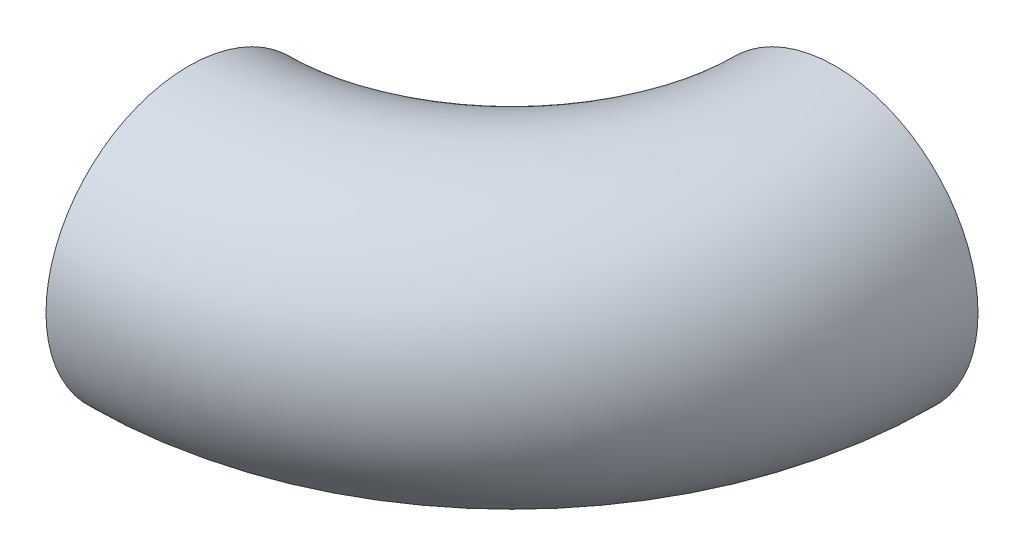
ISO-10303-21;
HEADER;
FILE_DESCRIPTION(('STEP AP214'),'2;1');
FILE_NAME('part.step','',(''),(''),'','','');
FILE_SCHEMA(('AUTOMOTIVE_DESIGN { 1 0 10303 214 1 1 1 1 }'));
ENDSEC;
DATA;
#1=APPLICATION_CONTEXT('core data for automotive mechanical design processes');
#2=APPLICATION_PROTOCOL_DEFINITION('international standard','automotive_design',2000,#1);
#3=PRODUCT_CONTEXT('',#1,'mechanical');
#4=PRODUCT('Part','Part','',(#3));
#5=PRODUCT_RELATED_PRODUCT_CATEGORY('part','',(#4));
#6=PRODUCT_DEFINITION_FORMATION('','',#4);
#7=PRODUCT_DEFINITION_CONTEXT('part definition',#1,'design');
#8=PRODUCT_DEFINITION('design','',#6,#7);
#9=PRODUCT_DEFINITION_SHAPE('','',#8);
#10=(LENGTH_UNIT() NAMED_UNIT(*) SI_UNIT(.MILLI.,.METRE.));
#11=(NAMED_UNIT(*) PLANE_ANGLE_UNIT() SI_UNIT($,.RADIAN.));
#12=(NAMED_UNIT(*) SI_UNIT($,.STERADIAN.) SOLID_ANGLE_UNIT());
#13=UNCERTAINTY_MEASURE_WITH_UNIT(LENGTH_MEASURE(1.E-05),#10,'distance_accuracy_value','');
#14=(GEOMETRIC_REPRESENTATION_CONTEXT(3) GLOBAL_UNCERTAINTY_ASSIGNED_CONTEXT((#13)) GLOBAL_UNIT_ASSIGNED_CONTEXT((#10,
#11,#12)) REPRESENTATION_CONTEXT('',''));
#15=CARTESIAN_POINT('',(0.,0.,0.));
#16=DIRECTION('',(0.,0.,1.));
#17=DIRECTION('',(1.,0.,0.));
#18=AXIS2_PLACEMENT_3D('',#15,#16,#17);
#19=CARTESIAN_POINT('',(0.,0.,0.));
#20=DIRECTION('',(0.,-1.,0.));
#21=DIRECTION('',(-1.,0.,0.));
#22=AXIS2_PLACEMENT_3D('',#19,#20,#21);
#23=TOROIDAL_SURFACE('',#22,31.8,14.);
#24=CARTESIAN_POINT('',(0.,0.,31.8));
#25=DIRECTION('',(-1.,0.,0.));
#26=DIRECTION('',(0.,0.,1.));
#27=AXIS2_PLACEMENT_3D('',#24,#25,#26);
#28=CIRCLE('',#27,14.);
#29=CARTESIAN_POINT('',(0.,0.,17.8));
#30=VERTEX_POINT('',#29);
#31=EDGE_CURVE('E28',#30,#30,#28,.T.);
#32=ORIENTED_EDGE('',*,*,#31,.F.);
#33=CARTESIAN_POINT('',(0.,0.,0.));
#34=DIRECTION('',(0.,1.,0.));
#35=DIRECTION('',(-1.,0.,0.));
#36=AXIS2_PLACEMENT_3D('',#33,#34,#35);
#37=CIRCLE('',#36,17.8);
#38=CARTESIAN_POINT('',(17.8,0.,0.));
#39=VERTEX_POINT('',#38);
#40=EDGE_CURVE('E11',#30,#39,#37,.T.);
#41=ORIENTED_EDGE('',*,*,#40,.T.);
#42=CARTESIAN_POINT('',(31.8,0.,0.));
#43=DIRECTION('',(0.,0.,1.));
#44=DIRECTION('',(1.,0.,0.));
#45=AXIS2_PLACEMENT_3D('',#42,#43,#44);
#46=CIRCLE('',#45,14.);
#47=EDGE_CURVE('E21',#39,#39,#46,.T.);
#48=ORIENTED_EDGE('',*,*,#47,.T.);
#49=ORIENTED_EDGE('',*,*,#40,.F.);
#50=EDGE_LOOP('',(#32,#41,#48,#49));
#51=FACE_BOUND('',#50,.T.);
#52=ADVANCED_FACE('F17',(#51),#23,.T.);
#53=CARTESIAN_POINT('',(0.,15.4,0.));
#54=DIRECTION('',(-1.,0.,0.));
#55=DIRECTION('',(0.,0.,1.));
#56=AXIS2_PLACEMENT_3D('',#53,#54,#55);
#57=PLANE('',#56);
#58=CARTESIAN_POINT('',(0.,0.,31.8));
#59=DIRECTION('',(1.,0.,0.));
#60=DIRECTION('',(0.,0.,1.));
#61=AXIS2_PLACEMENT_3D('',#58,#59,#60);
#62=CIRCLE('',#61,12.5);
#63=CARTESIAN_POINT('',(0.,0.,19.3));
#64=VERTEX_POINT('',#63);
#65=EDGE_CURVE('E59',#64,#64,#62,.T.);
#66=ORIENTED_EDGE('',*,*,#65,.T.);
#67=EDGE_LOOP('',(#66));
#68=FACE_BOUND('',#67,.T.);
#69=ORIENTED_EDGE('',*,*,#31,.T.);
#70=EDGE_LOOP('',(#69));
#71=FACE_BOUND('',#70,.T.);
#72=ADVANCED_FACE('F19',(#68,#71),#57,.T.);
#73=CARTESIAN_POINT('',(0.,0.,0.));
#74=DIRECTION('',(0.,-1.,0.));
#75=DIRECTION('',(-1.,0.,0.));
#76=AXIS2_PLACEMENT_3D('',#73,#74,#75);
#77=TOROIDAL_SURFACE('',#76,31.8,12.5);
#78=CARTESIAN_POINT('',(31.8,0.,0.));
#79=DIRECTION('',(0.,0.,-1.));
#80=DIRECTION('',(1.,0.,0.));
#81=AXIS2_PLACEMENT_3D('',#78,#79,#80);
#82=CIRCLE('',#81,12.5);
#83=CARTESIAN_POINT('',(19.3,0.,0.));
#84=VERTEX_POINT('',#83);
#85=EDGE_CURVE('E58',#84,#84,#82,.T.);
#86=ORIENTED_EDGE('',*,*,#85,.T.);
#87=CARTESIAN_POINT('',(0.,0.,0.));
#88=DIRECTION('',(0.,-1.,0.));
#89=DIRECTION('',(-1.,0.,0.));
#90=AXIS2_PLACEMENT_3D('',#87,#88,#89);
#91=CIRCLE('',#90,19.3);
#92=EDGE_CURVE('E55',#84,#64,#91,.T.);
#93=ORIENTED_EDGE('',*,*,#92,.T.);
#94=ORIENTED_EDGE('',*,*,#65,.F.);
#95=ORIENTED_EDGE('',*,*,#92,.F.);
#96=EDGE_LOOP('',(#86,#93,#94,#95));
#97=FACE_BOUND('',#96,.T.);
#98=ADVANCED_FACE('F56',(#97),#77,.F.);
#99=CARTESIAN_POINT('',(0.,15.4,0.));
#100=DIRECTION('',(0.,0.,1.));
#101=DIRECTION('',(1.,0.,0.));
#102=AXIS2_PLACEMENT_3D('',#99,#100,#101);
#103=PLANE('',#102);
#104=ORIENTED_EDGE('',*,*,#85,.F.);
#105=EDGE_LOOP('',(#104));
#106=FACE_BOUND('',#105,.T.);
#107=ORIENTED_EDGE('',*,*,#47,.F.);
#108=EDGE_LOOP('',(#107));
#109=FACE_BOUND('',#108,.T.);
#110=ADVANCED_FACE('F81',(#106,#109),#103,.F.);
#111=CLOSED_SHELL('',(#52,#72,#98,#110));
#112=MANIFOLD_SOLID_BREP('B1',#111);
#113=ADVANCED_BREP_SHAPE_REPRESENTATION('',(#18,#112),#14);
#114=SHAPE_DEFINITION_REPRESENTATION(#9,#113);
ENDSEC;
END-ISO-10303-21;
